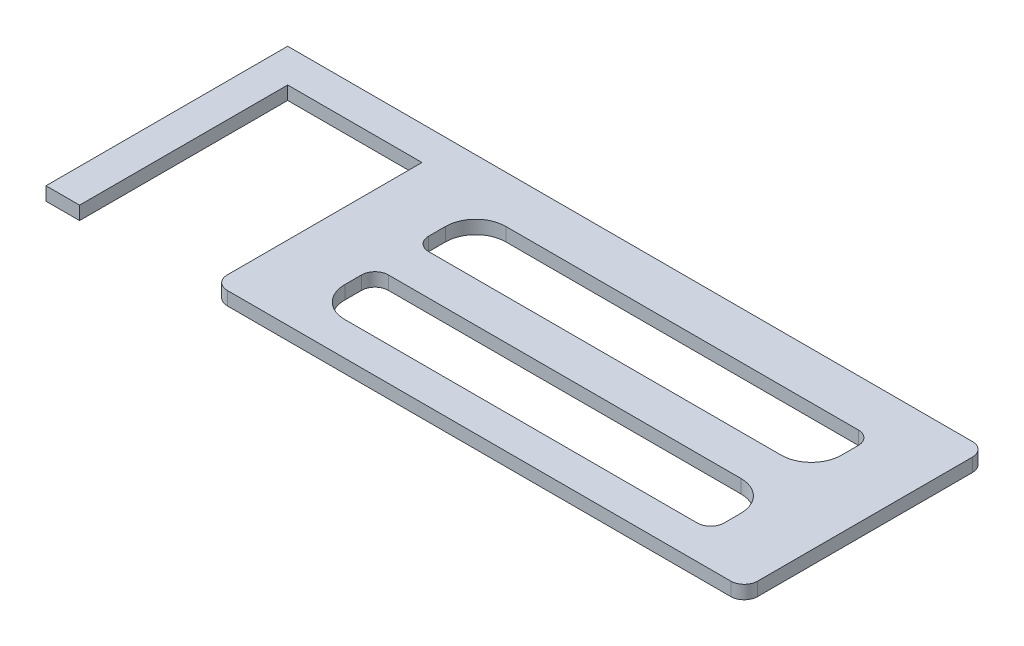
ISO-10303-21;
HEADER;
FILE_DESCRIPTION(('STEP AP214'),'2;1');
FILE_NAME('part.step','',(''),(''),'','','');
FILE_SCHEMA(('AUTOMOTIVE_DESIGN { 1 0 10303 214 1 1 1 1 }'));
ENDSEC;
DATA;
#1=APPLICATION_CONTEXT('core data for automotive mechanical design processes');
#2=APPLICATION_PROTOCOL_DEFINITION('international standard','automotive_design',2000,#1);
#3=PRODUCT_CONTEXT('',#1,'mechanical');
#4=PRODUCT('Part','Part','',(#3));
#5=PRODUCT_RELATED_PRODUCT_CATEGORY('part','',(#4));
#6=PRODUCT_DEFINITION_FORMATION('','',#4);
#7=PRODUCT_DEFINITION_CONTEXT('part definition',#1,'design');
#8=PRODUCT_DEFINITION('design','',#6,#7);
#9=PRODUCT_DEFINITION_SHAPE('','',#8);
#10=(LENGTH_UNIT() NAMED_UNIT(*) SI_UNIT(.MILLI.,.METRE.));
#11=(NAMED_UNIT(*) PLANE_ANGLE_UNIT() SI_UNIT($,.RADIAN.));
#12=(NAMED_UNIT(*) SI_UNIT($,.STERADIAN.) SOLID_ANGLE_UNIT());
#13=UNCERTAINTY_MEASURE_WITH_UNIT(LENGTH_MEASURE(1.E-05),#10,'distance_accuracy_value','');
#14=(GEOMETRIC_REPRESENTATION_CONTEXT(3) GLOBAL_UNCERTAINTY_ASSIGNED_CONTEXT((#13)) GLOBAL_UNIT_ASSIGNED_CONTEXT((#10,
#11,#12)) REPRESENTATION_CONTEXT('',''));
#15=CARTESIAN_POINT('',(0.,0.,0.));
#16=DIRECTION('',(0.,0.,1.));
#17=DIRECTION('',(1.,0.,0.));
#18=AXIS2_PLACEMENT_3D('',#15,#16,#17);
#19=CARTESIAN_POINT('',(-37.5,2.,16.));
#20=DIRECTION('',(0.,-1.,0.));
#21=DIRECTION('',(0.,0.,-1.));
#22=AXIS2_PLACEMENT_3D('',#19,#20,#21);
#23=PLANE('',#22);
#24=CARTESIAN_POINT('',(-25.,2.,8.5));
#25=DIRECTION('',(0.,1.,0.));
#26=DIRECTION('',(0.,0.,-1.));
#27=AXIS2_PLACEMENT_3D('',#24,#25,#26);
#28=CIRCLE('',#27,4.5);
#29=CARTESIAN_POINT('',(-29.5,2.,8.5));
#30=VERTEX_POINT('',#29);
#31=CARTESIAN_POINT('',(-25.,2.,13.));
#32=VERTEX_POINT('',#31);
#33=EDGE_CURVE('E277',#30,#32,#28,.T.);
#34=ORIENTED_EDGE('',*,*,#33,.F.);
#35=DIRECTION('',(0.,0.,1.));
#36=VECTOR('',#35,1.);
#37=CARTESIAN_POINT('',(-29.5,2.,6.00000000000002));
#38=LINE('',#37,#36);
#39=CARTESIAN_POINT('',(-29.5,2.,6.00000000000002));
#40=VERTEX_POINT('',#39);
#41=EDGE_CURVE('E293',#40,#30,#38,.T.);
#42=ORIENTED_EDGE('',*,*,#41,.F.);
#43=CARTESIAN_POINT('',(-27.5,2.,6.));
#44=DIRECTION('',(0.,1.,0.));
#45=DIRECTION('',(0.,0.,-1.));
#46=AXIS2_PLACEMENT_3D('',#43,#44,#45);
#47=CIRCLE('',#46,2.);
#48=CARTESIAN_POINT('',(-27.5,2.,4.));
#49=VERTEX_POINT('',#48);
#50=EDGE_CURVE('E290',#49,#40,#47,.T.);
#51=ORIENTED_EDGE('',*,*,#50,.F.);
#52=DIRECTION('',(-1.,0.,0.));
#53=VECTOR('',#52,1.);
#54=CARTESIAN_POINT('',(-27.5,2.,4.));
#55=LINE('',#54,#53);
#56=CARTESIAN_POINT('',(25.,2.,4.));
#57=VERTEX_POINT('',#56);
#58=EDGE_CURVE('E288',#57,#49,#55,.T.);
#59=ORIENTED_EDGE('',*,*,#58,.F.);
#60=CARTESIAN_POINT('',(25.,2.,8.5));
#61=DIRECTION('',(0.,1.,0.));
#62=DIRECTION('',(0.,0.,-1.));
#63=AXIS2_PLACEMENT_3D('',#60,#61,#62);
#64=CIRCLE('',#63,4.5);
#65=CARTESIAN_POINT('',(29.5,2.,8.5));
#66=VERTEX_POINT('',#65);
#67=EDGE_CURVE('E286',#66,#57,#64,.T.);
#68=ORIENTED_EDGE('',*,*,#67,.F.);
#69=DIRECTION('',(0.,0.,-1.));
#70=VECTOR('',#69,1.);
#71=CARTESIAN_POINT('',(29.5,2.,8.5));
#72=LINE('',#71,#70);
#73=CARTESIAN_POINT('',(29.5,2.,11.));
#74=VERTEX_POINT('',#73);
#75=EDGE_CURVE('E284',#74,#66,#72,.T.);
#76=ORIENTED_EDGE('',*,*,#75,.F.);
#77=CARTESIAN_POINT('',(27.5,2.,11.));
#78=DIRECTION('',(0.,1.,0.));
#79=DIRECTION('',(0.,0.,1.));
#80=AXIS2_PLACEMENT_3D('',#77,#78,#79);
#81=CIRCLE('',#80,2.);
#82=CARTESIAN_POINT('',(27.5,2.,13.));
#83=VERTEX_POINT('',#82);
#84=EDGE_CURVE('E282',#83,#74,#81,.T.);
#85=ORIENTED_EDGE('',*,*,#84,.F.);
#86=DIRECTION('',(1.,0.,0.));
#87=VECTOR('',#86,1.);
#88=CARTESIAN_POINT('',(-25.,2.,13.));
#89=LINE('',#88,#87);
#90=EDGE_CURVE('E279',#32,#83,#89,.T.);
#91=ORIENTED_EDGE('',*,*,#90,.F.);
#92=EDGE_LOOP('',(#34,#42,#51,#59,#68,#76,#85,#91));
#93=FACE_BOUND('',#92,.T.);
#94=DIRECTION('',(-1.,0.,0.));
#95=VECTOR('',#94,1.);
#96=CARTESIAN_POINT('',(-39.5,2.,-18.));
#97=LINE('',#96,#95);
#98=CARTESIAN_POINT('',(37.5,2.,-18.));
#99=VERTEX_POINT('',#98);
#100=CARTESIAN_POINT('',(-64.5,2.,-18.));
#101=VERTEX_POINT('',#100);
#102=EDGE_CURVE('E336',#99,#101,#97,.T.);
#103=ORIENTED_EDGE('',*,*,#102,.T.);
#104=DIRECTION('',(0.,0.,1.));
#105=VECTOR('',#104,1.);
#106=CARTESIAN_POINT('',(-64.5,2.,-18.));
#107=LINE('',#106,#105);
#108=CARTESIAN_POINT('',(-64.5,2.,18.));
#109=VERTEX_POINT('',#108);
#110=EDGE_CURVE('E339',#101,#109,#107,.T.);
#111=ORIENTED_EDGE('',*,*,#110,.T.);
#112=DIRECTION('',(1.,0.,0.));
#113=VECTOR('',#112,1.);
#114=CARTESIAN_POINT('',(-64.5,2.,18.));
#115=LINE('',#114,#113);
#116=CARTESIAN_POINT('',(-59.5,2.,18.));
#117=VERTEX_POINT('',#116);
#118=EDGE_CURVE('E342',#109,#117,#115,.T.);
#119=ORIENTED_EDGE('',*,*,#118,.T.);
#120=DIRECTION('',(0.,0.,-1.));
#121=VECTOR('',#120,1.);
#122=CARTESIAN_POINT('',(-59.5,2.,18.));
#123=LINE('',#122,#121);
#124=CARTESIAN_POINT('',(-59.5,2.,-13.));
#125=VERTEX_POINT('',#124);
#126=EDGE_CURVE('E344',#117,#125,#123,.T.);
#127=ORIENTED_EDGE('',*,*,#126,.T.);
#128=DIRECTION('',(1.,0.,0.));
#129=VECTOR('',#128,1.);
#130=CARTESIAN_POINT('',(-39.5,2.,-13.));
#131=LINE('',#130,#129);
#132=CARTESIAN_POINT('',(-39.5,2.,-13.));
#133=VERTEX_POINT('',#132);
#134=EDGE_CURVE('E346',#125,#133,#131,.T.);
#135=ORIENTED_EDGE('',*,*,#134,.T.);
#136=DIRECTION('',(0.,0.,1.));
#137=VECTOR('',#136,1.);
#138=CARTESIAN_POINT('',(-39.5,2.,16.));
#139=LINE('',#138,#137);
#140=CARTESIAN_POINT('',(-39.5,2.,16.));
#141=VERTEX_POINT('',#140);
#142=EDGE_CURVE('E348',#133,#141,#139,.T.);
#143=ORIENTED_EDGE('',*,*,#142,.T.);
#144=CARTESIAN_POINT('',(-37.5,2.,16.));
#145=DIRECTION('',(0.,1.,0.));
#146=DIRECTION('',(0.,0.,-1.));
#147=AXIS2_PLACEMENT_3D('',#144,#145,#146);
#148=CIRCLE('',#147,2.);
#149=CARTESIAN_POINT('',(-37.5,2.,18.));
#150=VERTEX_POINT('',#149);
#151=EDGE_CURVE('E350',#141,#150,#148,.T.);
#152=ORIENTED_EDGE('',*,*,#151,.T.);
#153=DIRECTION('',(1.,0.,0.));
#154=VECTOR('',#153,1.);
#155=CARTESIAN_POINT('',(-37.5,2.,18.));
#156=LINE('',#155,#154);
#157=CARTESIAN_POINT('',(37.5,2.,18.));
#158=VERTEX_POINT('',#157);
#159=EDGE_CURVE('E352',#150,#158,#156,.T.);
#160=ORIENTED_EDGE('',*,*,#159,.T.);
#161=CARTESIAN_POINT('',(37.5,2.,16.));
#162=DIRECTION('',(0.,1.,0.));
#163=DIRECTION('',(0.,0.,1.));
#164=AXIS2_PLACEMENT_3D('',#161,#162,#163);
#165=CIRCLE('',#164,2.);
#166=CARTESIAN_POINT('',(39.5,2.,16.));
#167=VERTEX_POINT('',#166);
#168=EDGE_CURVE('E354',#158,#167,#165,.T.);
#169=ORIENTED_EDGE('',*,*,#168,.T.);
#170=DIRECTION('',(0.,0.,-1.));
#171=VECTOR('',#170,1.);
#172=CARTESIAN_POINT('',(39.5,2.,16.));
#173=LINE('',#172,#171);
#174=CARTESIAN_POINT('',(39.5,2.,-16.));
#175=VERTEX_POINT('',#174);
#176=EDGE_CURVE('E356',#167,#175,#173,.T.);
#177=ORIENTED_EDGE('',*,*,#176,.T.);
#178=CARTESIAN_POINT('',(37.5,2.,-16.));
#179=DIRECTION('',(0.,1.,0.));
#180=DIRECTION('',(0.,0.,-1.));
#181=AXIS2_PLACEMENT_3D('',#178,#179,#180);
#182=CIRCLE('',#181,2.);
#183=EDGE_CURVE('E358',#175,#99,#182,.T.);
#184=ORIENTED_EDGE('',*,*,#183,.T.);
#185=EDGE_LOOP('',(#103,#111,#119,#127,#135,#143,#152,#160,#169,#177,#184));
#186=FACE_BOUND('',#185,.T.);
#187=CARTESIAN_POINT('',(25.,2.,-6.5));
#188=DIRECTION('',(0.,1.,0.));
#189=DIRECTION('',(0.,0.,-1.));
#190=AXIS2_PLACEMENT_3D('',#187,#188,#189);
#191=CIRCLE('',#190,4.5);
#192=CARTESIAN_POINT('',(25.,2.,-2.));
#193=VERTEX_POINT('',#192);
#194=CARTESIAN_POINT('',(29.5,2.,-6.50000000000003));
#195=VERTEX_POINT('',#194);
#196=EDGE_CURVE('E212',#193,#195,#191,.T.);
#197=ORIENTED_EDGE('',*,*,#196,.F.);
#198=DIRECTION('',(1.,0.,0.));
#199=VECTOR('',#198,1.);
#200=CARTESIAN_POINT('',(-27.5,2.,-2.));
#201=LINE('',#200,#199);
#202=CARTESIAN_POINT('',(-27.5,2.,-2.));
#203=VERTEX_POINT('',#202);
#204=EDGE_CURVE('E245',#203,#193,#201,.T.);
#205=ORIENTED_EDGE('',*,*,#204,.F.);
#206=CARTESIAN_POINT('',(-27.5,2.,-4.));
#207=DIRECTION('',(0.,1.,0.));
#208=DIRECTION('',(0.,0.,-1.));
#209=AXIS2_PLACEMENT_3D('',#206,#207,#208);
#210=CIRCLE('',#209,2.);
#211=CARTESIAN_POINT('',(-29.5,2.,-4.00000000000002));
#212=VERTEX_POINT('',#211);
#213=EDGE_CURVE('E243',#212,#203,#210,.T.);
#214=ORIENTED_EDGE('',*,*,#213,.F.);
#215=DIRECTION('',(0.,0.,1.));
#216=VECTOR('',#215,1.);
#217=CARTESIAN_POINT('',(-29.5,2.,-6.49999999999997));
#218=LINE('',#217,#216);
#219=CARTESIAN_POINT('',(-29.5,2.,-6.49999999999997));
#220=VERTEX_POINT('',#219);
#221=EDGE_CURVE('E241',#220,#212,#218,.T.);
#222=ORIENTED_EDGE('',*,*,#221,.F.);
#223=CARTESIAN_POINT('',(-25.,2.,-6.5));
#224=DIRECTION('',(0.,1.,0.));
#225=DIRECTION('',(0.,0.,-1.));
#226=AXIS2_PLACEMENT_3D('',#223,#224,#225);
#227=CIRCLE('',#226,4.5);
#228=CARTESIAN_POINT('',(-25.,2.,-11.));
#229=VERTEX_POINT('',#228);
#230=EDGE_CURVE('E239',#229,#220,#227,.T.);
#231=ORIENTED_EDGE('',*,*,#230,.F.);
#232=DIRECTION('',(-1.,0.,0.));
#233=VECTOR('',#232,1.);
#234=CARTESIAN_POINT('',(-25.,2.,-11.));
#235=LINE('',#234,#233);
#236=CARTESIAN_POINT('',(27.5,2.,-11.));
#237=VERTEX_POINT('',#236);
#238=EDGE_CURVE('E235',#237,#229,#235,.T.);
#239=ORIENTED_EDGE('',*,*,#238,.F.);
#240=CARTESIAN_POINT('',(27.5,2.,-9.));
#241=DIRECTION('',(0.,1.,0.));
#242=DIRECTION('',(0.,0.,-1.));
#243=AXIS2_PLACEMENT_3D('',#240,#241,#242);
#244=CIRCLE('',#243,2.);
#245=CARTESIAN_POINT('',(29.5,2.,-8.99999999999999));
#246=VERTEX_POINT('',#245);
#247=EDGE_CURVE('E233',#246,#237,#244,.T.);
#248=ORIENTED_EDGE('',*,*,#247,.F.);
#249=DIRECTION('',(0.,0.,-1.));
#250=VECTOR('',#249,1.);
#251=CARTESIAN_POINT('',(29.5,2.,-8.99999999999999));
#252=LINE('',#251,#250);
#253=EDGE_CURVE('E220',#195,#246,#252,.T.);
#254=ORIENTED_EDGE('',*,*,#253,.F.);
#255=EDGE_LOOP('',(#197,#205,#214,#222,#231,#239,#248,#254));
#256=FACE_BOUND('',#255,.T.);
#257=ADVANCED_FACE('F33',(#93,#186,#256),#23,.F.);
#258=CARTESIAN_POINT('',(-37.5,0.,16.));
#259=DIRECTION('',(0.,-1.,0.));
#260=DIRECTION('',(0.,0.,-1.));
#261=AXIS2_PLACEMENT_3D('',#258,#259,#260);
#262=PLANE('',#261);
#263=DIRECTION('',(0.,0.,1.));
#264=VECTOR('',#263,1.);
#265=CARTESIAN_POINT('',(-64.5,0.,-18.));
#266=LINE('',#265,#264);
#267=CARTESIAN_POINT('',(-64.5,0.,-18.));
#268=VERTEX_POINT('',#267);
#269=CARTESIAN_POINT('',(-64.5,0.,18.));
#270=VERTEX_POINT('',#269);
#271=EDGE_CURVE('E335',#268,#270,#266,.T.);
#272=ORIENTED_EDGE('',*,*,#271,.F.);
#273=DIRECTION('',(-1.,0.,0.));
#274=VECTOR('',#273,1.);
#275=CARTESIAN_POINT('',(-39.5,0.,-18.));
#276=LINE('',#275,#274);
#277=CARTESIAN_POINT('',(37.5,0.,-18.));
#278=VERTEX_POINT('',#277);
#279=EDGE_CURVE('E340',#278,#268,#276,.T.);
#280=ORIENTED_EDGE('',*,*,#279,.F.);
#281=CARTESIAN_POINT('',(37.5,0.,-16.));
#282=DIRECTION('',(0.,1.,0.));
#283=DIRECTION('',(0.,0.,-1.));
#284=AXIS2_PLACEMENT_3D('',#281,#282,#283);
#285=CIRCLE('',#284,2.);
#286=CARTESIAN_POINT('',(39.5,0.,-16.));
#287=VERTEX_POINT('',#286);
#288=EDGE_CURVE('E379',#287,#278,#285,.T.);
#289=ORIENTED_EDGE('',*,*,#288,.F.);
#290=DIRECTION('',(0.,0.,-1.));
#291=VECTOR('',#290,1.);
#292=CARTESIAN_POINT('',(39.5,0.,16.));
#293=LINE('',#292,#291);
#294=CARTESIAN_POINT('',(39.5,0.,16.));
#295=VERTEX_POINT('',#294);
#296=EDGE_CURVE('E377',#295,#287,#293,.T.);
#297=ORIENTED_EDGE('',*,*,#296,.F.);
#298=CARTESIAN_POINT('',(37.5,0.,16.));
#299=DIRECTION('',(0.,1.,0.));
#300=DIRECTION('',(0.,0.,1.));
#301=AXIS2_PLACEMENT_3D('',#298,#299,#300);
#302=CIRCLE('',#301,2.);
#303=CARTESIAN_POINT('',(37.5,0.,18.));
#304=VERTEX_POINT('',#303);
#305=EDGE_CURVE('E375',#304,#295,#302,.T.);
#306=ORIENTED_EDGE('',*,*,#305,.F.);
#307=DIRECTION('',(1.,0.,0.));
#308=VECTOR('',#307,1.);
#309=CARTESIAN_POINT('',(-37.5,0.,18.));
#310=LINE('',#309,#308);
#311=CARTESIAN_POINT('',(-37.5,0.,18.));
#312=VERTEX_POINT('',#311);
#313=EDGE_CURVE('E373',#312,#304,#310,.T.);
#314=ORIENTED_EDGE('',*,*,#313,.F.);
#315=CARTESIAN_POINT('',(-37.5,0.,16.));
#316=DIRECTION('',(0.,1.,0.));
#317=DIRECTION('',(0.,0.,-1.));
#318=AXIS2_PLACEMENT_3D('',#315,#316,#317);
#319=CIRCLE('',#318,2.);
#320=CARTESIAN_POINT('',(-39.5,0.,16.));
#321=VERTEX_POINT('',#320);
#322=EDGE_CURVE('E371',#321,#312,#319,.T.);
#323=ORIENTED_EDGE('',*,*,#322,.F.);
#324=DIRECTION('',(0.,0.,1.));
#325=VECTOR('',#324,1.);
#326=CARTESIAN_POINT('',(-39.5,0.,16.));
#327=LINE('',#326,#325);
#328=CARTESIAN_POINT('',(-39.5,0.,-13.));
#329=VERTEX_POINT('',#328);
#330=EDGE_CURVE('E369',#329,#321,#327,.T.);
#331=ORIENTED_EDGE('',*,*,#330,.F.);
#332=DIRECTION('',(1.,0.,0.));
#333=VECTOR('',#332,1.);
#334=CARTESIAN_POINT('',(-39.5,0.,-13.));
#335=LINE('',#334,#333);
#336=CARTESIAN_POINT('',(-59.5,0.,-13.));
#337=VERTEX_POINT('',#336);
#338=EDGE_CURVE('E367',#337,#329,#335,.T.);
#339=ORIENTED_EDGE('',*,*,#338,.F.);
#340=DIRECTION('',(0.,0.,-1.));
#341=VECTOR('',#340,1.);
#342=CARTESIAN_POINT('',(-59.5,0.,18.));
#343=LINE('',#342,#341);
#344=CARTESIAN_POINT('',(-59.5,0.,18.));
#345=VERTEX_POINT('',#344);
#346=EDGE_CURVE('E365',#345,#337,#343,.T.);
#347=ORIENTED_EDGE('',*,*,#346,.F.);
#348=DIRECTION('',(1.,0.,0.));
#349=VECTOR('',#348,1.);
#350=CARTESIAN_POINT('',(-64.5,0.,18.));
#351=LINE('',#350,#349);
#352=EDGE_CURVE('E363',#270,#345,#351,.T.);
#353=ORIENTED_EDGE('',*,*,#352,.F.);
#354=EDGE_LOOP('',(#272,#280,#289,#297,#306,#314,#323,#331,#339,#347,#353));
#355=FACE_BOUND('',#354,.T.);
#356=DIRECTION('',(0.,0.,1.));
#357=VECTOR('',#356,1.);
#358=CARTESIAN_POINT('',(-29.5,0.,6.00000000000002));
#359=LINE('',#358,#357);
#360=CARTESIAN_POINT('',(-29.5,0.,6.00000000000002));
#361=VERTEX_POINT('',#360);
#362=CARTESIAN_POINT('',(-29.5,0.,8.5));
#363=VERTEX_POINT('',#362);
#364=EDGE_CURVE('E280',#361,#363,#359,.T.);
#365=ORIENTED_EDGE('',*,*,#364,.T.);
#366=CARTESIAN_POINT('',(-25.,0.,8.5));
#367=DIRECTION('',(0.,1.,0.));
#368=DIRECTION('',(0.,0.,-1.));
#369=AXIS2_PLACEMENT_3D('',#366,#367,#368);
#370=CIRCLE('',#369,4.5);
#371=CARTESIAN_POINT('',(-25.,0.,13.));
#372=VERTEX_POINT('',#371);
#373=EDGE_CURVE('E228',#363,#372,#370,.T.);
#374=ORIENTED_EDGE('',*,*,#373,.T.);
#375=DIRECTION('',(1.,0.,0.));
#376=VECTOR('',#375,1.);
#377=CARTESIAN_POINT('',(-25.,0.,13.));
#378=LINE('',#377,#376);
#379=CARTESIAN_POINT('',(27.5,0.,13.));
#380=VERTEX_POINT('',#379);
#381=EDGE_CURVE('E298',#372,#380,#378,.T.);
#382=ORIENTED_EDGE('',*,*,#381,.T.);
#383=CARTESIAN_POINT('',(27.5,0.,11.));
#384=DIRECTION('',(0.,1.,0.));
#385=DIRECTION('',(0.,0.,1.));
#386=AXIS2_PLACEMENT_3D('',#383,#384,#385);
#387=CIRCLE('',#386,2.);
#388=CARTESIAN_POINT('',(29.5,0.,11.));
#389=VERTEX_POINT('',#388);
#390=EDGE_CURVE('E301',#380,#389,#387,.T.);
#391=ORIENTED_EDGE('',*,*,#390,.T.);
#392=DIRECTION('',(0.,0.,-1.));
#393=VECTOR('',#392,1.);
#394=CARTESIAN_POINT('',(29.5,0.,8.5));
#395=LINE('',#394,#393);
#396=CARTESIAN_POINT('',(29.5,0.,8.5));
#397=VERTEX_POINT('',#396);
#398=EDGE_CURVE('E304',#389,#397,#395,.T.);
#399=ORIENTED_EDGE('',*,*,#398,.T.);
#400=CARTESIAN_POINT('',(25.,0.,8.5));
#401=DIRECTION('',(0.,1.,0.));
#402=DIRECTION('',(0.,0.,-1.));
#403=AXIS2_PLACEMENT_3D('',#400,#401,#402);
#404=CIRCLE('',#403,4.5);
#405=CARTESIAN_POINT('',(25.,0.,4.));
#406=VERTEX_POINT('',#405);
#407=EDGE_CURVE('E307',#397,#406,#404,.T.);
#408=ORIENTED_EDGE('',*,*,#407,.T.);
#409=DIRECTION('',(-1.,0.,0.));
#410=VECTOR('',#409,1.);
#411=CARTESIAN_POINT('',(-27.5,0.,4.));
#412=LINE('',#411,#410);
#413=CARTESIAN_POINT('',(-27.5,0.,4.));
#414=VERTEX_POINT('',#413);
#415=EDGE_CURVE('E310',#406,#414,#412,.T.);
#416=ORIENTED_EDGE('',*,*,#415,.T.);
#417=CARTESIAN_POINT('',(-27.5,0.,6.));
#418=DIRECTION('',(0.,1.,0.));
#419=DIRECTION('',(0.,0.,-1.));
#420=AXIS2_PLACEMENT_3D('',#417,#418,#419);
#421=CIRCLE('',#420,2.);
#422=EDGE_CURVE('E313',#414,#361,#421,.T.);
#423=ORIENTED_EDGE('',*,*,#422,.T.);
#424=EDGE_LOOP('',(#365,#374,#382,#391,#399,#408,#416,#423));
#425=FACE_BOUND('',#424,.T.);
#426=DIRECTION('',(1.,0.,0.));
#427=VECTOR('',#426,1.);
#428=CARTESIAN_POINT('',(-27.5,0.,-2.));
#429=LINE('',#428,#427);
#430=CARTESIAN_POINT('',(-27.5,0.,-2.));
#431=VERTEX_POINT('',#430);
#432=CARTESIAN_POINT('',(25.,0.,-2.));
#433=VERTEX_POINT('',#432);
#434=EDGE_CURVE('E221',#431,#433,#429,.T.);
#435=ORIENTED_EDGE('',*,*,#434,.T.);
#436=CARTESIAN_POINT('',(25.,0.,-6.5));
#437=DIRECTION('',(0.,1.,0.));
#438=DIRECTION('',(0.,0.,-1.));
#439=AXIS2_PLACEMENT_3D('',#436,#437,#438);
#440=CIRCLE('',#439,4.5);
#441=CARTESIAN_POINT('',(29.5,0.,-6.50000000000003));
#442=VERTEX_POINT('',#441);
#443=EDGE_CURVE('E56',#433,#442,#440,.T.);
#444=ORIENTED_EDGE('',*,*,#443,.T.);
#445=DIRECTION('',(0.,0.,-1.));
#446=VECTOR('',#445,1.);
#447=CARTESIAN_POINT('',(29.5,0.,-8.99999999999999));
#448=LINE('',#447,#446);
#449=CARTESIAN_POINT('',(29.5,0.,-8.99999999999999));
#450=VERTEX_POINT('',#449);
#451=EDGE_CURVE('E227',#442,#450,#448,.T.);
#452=ORIENTED_EDGE('',*,*,#451,.T.);
#453=CARTESIAN_POINT('',(27.5,0.,-9.));
#454=DIRECTION('',(0.,1.,0.));
#455=DIRECTION('',(0.,0.,-1.));
#456=AXIS2_PLACEMENT_3D('',#453,#454,#455);
#457=CIRCLE('',#456,2.);
#458=CARTESIAN_POINT('',(27.5,0.,-11.));
#459=VERTEX_POINT('',#458);
#460=EDGE_CURVE('E249',#450,#459,#457,.T.);
#461=ORIENTED_EDGE('',*,*,#460,.T.);
#462=DIRECTION('',(-1.,0.,0.));
#463=VECTOR('',#462,1.);
#464=CARTESIAN_POINT('',(-25.,0.,-11.));
#465=LINE('',#464,#463);
#466=CARTESIAN_POINT('',(-25.,0.,-11.));
#467=VERTEX_POINT('',#466);
#468=EDGE_CURVE('E252',#459,#467,#465,.T.);
#469=ORIENTED_EDGE('',*,*,#468,.T.);
#470=CARTESIAN_POINT('',(-25.,0.,-6.5));
#471=DIRECTION('',(0.,1.,0.));
#472=DIRECTION('',(0.,0.,-1.));
#473=AXIS2_PLACEMENT_3D('',#470,#471,#472);
#474=CIRCLE('',#473,4.5);
#475=CARTESIAN_POINT('',(-29.5,0.,-6.49999999999997));
#476=VERTEX_POINT('',#475);
#477=EDGE_CURVE('E255',#467,#476,#474,.T.);
#478=ORIENTED_EDGE('',*,*,#477,.T.);
#479=DIRECTION('',(0.,0.,1.));
#480=VECTOR('',#479,1.);
#481=CARTESIAN_POINT('',(-29.5,0.,-6.49999999999997));
#482=LINE('',#481,#480);
#483=CARTESIAN_POINT('',(-29.5,0.,-4.00000000000002));
#484=VERTEX_POINT('',#483);
#485=EDGE_CURVE('E258',#476,#484,#482,.T.);
#486=ORIENTED_EDGE('',*,*,#485,.T.);
#487=CARTESIAN_POINT('',(-27.5,0.,-4.));
#488=DIRECTION('',(0.,1.,0.));
#489=DIRECTION('',(0.,0.,-1.));
#490=AXIS2_PLACEMENT_3D('',#487,#488,#489);
#491=CIRCLE('',#490,2.);
#492=EDGE_CURVE('E261',#484,#431,#491,.T.);
#493=ORIENTED_EDGE('',*,*,#492,.T.);
#494=EDGE_LOOP('',(#435,#444,#452,#461,#469,#478,#486,#493));
#495=FACE_BOUND('',#494,.T.);
#496=ADVANCED_FACE('F418',(#355,#425,#495),#262,.T.);
#497=CARTESIAN_POINT('',(-64.5,2.,-18.));
#498=DIRECTION('',(1.,0.,0.));
#499=DIRECTION('',(0.,0.,-1.));
#500=AXIS2_PLACEMENT_3D('',#497,#498,#499);
#501=PLANE('',#500);
#502=ORIENTED_EDGE('',*,*,#271,.T.);
#503=DIRECTION('',(0.,-1.,0.));
#504=VECTOR('',#503,1.);
#505=CARTESIAN_POINT('',(-64.5,2.,18.));
#506=LINE('',#505,#504);
#507=EDGE_CURVE('E41',#109,#270,#506,.T.);
#508=ORIENTED_EDGE('',*,*,#507,.F.);
#509=ORIENTED_EDGE('',*,*,#110,.F.);
#510=DIRECTION('',(0.,-1.,0.));
#511=VECTOR('',#510,1.);
#512=CARTESIAN_POINT('',(-64.5,2.,-18.));
#513=LINE('',#512,#511);
#514=EDGE_CURVE('E11',#101,#268,#513,.T.);
#515=ORIENTED_EDGE('',*,*,#514,.T.);
#516=EDGE_LOOP('',(#502,#508,#509,#515));
#517=FACE_BOUND('',#516,.T.);
#518=ADVANCED_FACE('F35',(#517),#501,.F.);
#519=CARTESIAN_POINT('',(-64.5,2.,18.));
#520=DIRECTION('',(0.,0.,-1.));
#521=DIRECTION('',(-1.,0.,0.));
#522=AXIS2_PLACEMENT_3D('',#519,#520,#521);
#523=PLANE('',#522);
#524=ORIENTED_EDGE('',*,*,#352,.T.);
#525=DIRECTION('',(0.,-1.,0.));
#526=VECTOR('',#525,1.);
#527=CARTESIAN_POINT('',(-59.5,2.,18.));
#528=LINE('',#527,#526);
#529=EDGE_CURVE('E405',#117,#345,#528,.T.);
#530=ORIENTED_EDGE('',*,*,#529,.F.);
#531=ORIENTED_EDGE('',*,*,#118,.F.);
#532=ORIENTED_EDGE('',*,*,#507,.T.);
#533=EDGE_LOOP('',(#524,#530,#531,#532));
#534=FACE_BOUND('',#533,.T.);
#535=ADVANCED_FACE('F412',(#534),#523,.F.);
#536=CARTESIAN_POINT('',(-59.5,2.,18.));
#537=DIRECTION('',(-1.,0.,0.));
#538=DIRECTION('',(0.,0.,1.));
#539=AXIS2_PLACEMENT_3D('',#536,#537,#538);
#540=PLANE('',#539);
#541=ORIENTED_EDGE('',*,*,#346,.T.);
#542=DIRECTION('',(0.,-1.,0.));
#543=VECTOR('',#542,1.);
#544=CARTESIAN_POINT('',(-59.5,2.,-13.));
#545=LINE('',#544,#543);
#546=EDGE_CURVE('E402',#125,#337,#545,.T.);
#547=ORIENTED_EDGE('',*,*,#546,.F.);
#548=ORIENTED_EDGE('',*,*,#126,.F.);
#549=ORIENTED_EDGE('',*,*,#529,.T.);
#550=EDGE_LOOP('',(#541,#547,#548,#549));
#551=FACE_BOUND('',#550,.T.);
#552=ADVANCED_FACE('F425',(#551),#540,.F.);
#553=CARTESIAN_POINT('',(-39.5,2.,-13.));
#554=DIRECTION('',(0.,0.,-1.));
#555=DIRECTION('',(-1.,0.,0.));
#556=AXIS2_PLACEMENT_3D('',#553,#554,#555);
#557=PLANE('',#556);
#558=ORIENTED_EDGE('',*,*,#338,.T.);
#559=DIRECTION('',(0.,-1.,0.));
#560=VECTOR('',#559,1.);
#561=CARTESIAN_POINT('',(-39.5,2.,-13.));
#562=LINE('',#561,#560);
#563=EDGE_CURVE('E399',#133,#329,#562,.T.);
#564=ORIENTED_EDGE('',*,*,#563,.F.);
#565=ORIENTED_EDGE('',*,*,#134,.F.);
#566=ORIENTED_EDGE('',*,*,#546,.T.);
#567=EDGE_LOOP('',(#558,#564,#565,#566));
#568=FACE_BOUND('',#567,.T.);
#569=ADVANCED_FACE('F429',(#568),#557,.F.);
#570=CARTESIAN_POINT('',(-39.5,2.,16.));
#571=DIRECTION('',(1.,0.,0.));
#572=DIRECTION('',(0.,0.,-1.));
#573=AXIS2_PLACEMENT_3D('',#570,#571,#572);
#574=PLANE('',#573);
#575=ORIENTED_EDGE('',*,*,#330,.T.);
#576=DIRECTION('',(0.,-1.,0.));
#577=VECTOR('',#576,1.);
#578=CARTESIAN_POINT('',(-39.5,2.,16.));
#579=LINE('',#578,#577);
#580=EDGE_CURVE('E396',#141,#321,#579,.T.);
#581=ORIENTED_EDGE('',*,*,#580,.F.);
#582=ORIENTED_EDGE('',*,*,#142,.F.);
#583=ORIENTED_EDGE('',*,*,#563,.T.);
#584=EDGE_LOOP('',(#575,#581,#582,#583));
#585=FACE_BOUND('',#584,.T.);
#586=ADVANCED_FACE('F463',(#585),#574,.F.);
#587=CARTESIAN_POINT('',(-37.5,2.,16.));
#588=DIRECTION('',(0.,-1.,0.));
#589=DIRECTION('',(0.,0.,-1.));
#590=AXIS2_PLACEMENT_3D('',#587,#588,#589);
#591=CYLINDRICAL_SURFACE('',#590,2.);
#592=ORIENTED_EDGE('',*,*,#322,.T.);
#593=DIRECTION('',(0.,-1.,0.));
#594=VECTOR('',#593,1.);
#595=CARTESIAN_POINT('',(-37.5,2.,18.));
#596=LINE('',#595,#594);
#597=EDGE_CURVE('E393',#150,#312,#596,.T.);
#598=ORIENTED_EDGE('',*,*,#597,.F.);
#599=ORIENTED_EDGE('',*,*,#151,.F.);
#600=ORIENTED_EDGE('',*,*,#580,.T.);
#601=EDGE_LOOP('',(#592,#598,#599,#600));
#602=FACE_BOUND('',#601,.T.);
#603=ADVANCED_FACE('F461',(#602),#591,.T.);
#604=CARTESIAN_POINT('',(-37.5,2.,18.));
#605=DIRECTION('',(0.,0.,-1.));
#606=DIRECTION('',(-1.,0.,0.));
#607=AXIS2_PLACEMENT_3D('',#604,#605,#606);
#608=PLANE('',#607);
#609=ORIENTED_EDGE('',*,*,#313,.T.);
#610=DIRECTION('',(0.,-1.,0.));
#611=VECTOR('',#610,1.);
#612=CARTESIAN_POINT('',(37.5,2.,18.));
#613=LINE('',#612,#611);
#614=EDGE_CURVE('E390',#158,#304,#613,.T.);
#615=ORIENTED_EDGE('',*,*,#614,.F.);
#616=ORIENTED_EDGE('',*,*,#159,.F.);
#617=ORIENTED_EDGE('',*,*,#597,.T.);
#618=EDGE_LOOP('',(#609,#615,#616,#617));
#619=FACE_BOUND('',#618,.T.);
#620=ADVANCED_FACE('F456',(#619),#608,.F.);
#621=CARTESIAN_POINT('',(37.5,2.,16.));
#622=DIRECTION('',(0.,-1.,0.));
#623=DIRECTION('',(0.,0.,-1.));
#624=AXIS2_PLACEMENT_3D('',#621,#622,#623);
#625=CYLINDRICAL_SURFACE('',#624,2.);
#626=ORIENTED_EDGE('',*,*,#305,.T.);
#627=DIRECTION('',(0.,-1.,0.));
#628=VECTOR('',#627,1.);
#629=CARTESIAN_POINT('',(39.5,2.,16.));
#630=LINE('',#629,#628);
#631=EDGE_CURVE('E387',#167,#295,#630,.T.);
#632=ORIENTED_EDGE('',*,*,#631,.F.);
#633=ORIENTED_EDGE('',*,*,#168,.F.);
#634=ORIENTED_EDGE('',*,*,#614,.T.);
#635=EDGE_LOOP('',(#626,#632,#633,#634));
#636=FACE_BOUND('',#635,.T.);
#637=ADVANCED_FACE('F451',(#636),#625,.T.);
#638=CARTESIAN_POINT('',(39.5,2.,16.));
#639=DIRECTION('',(-1.,0.,0.));
#640=DIRECTION('',(0.,0.,1.));
#641=AXIS2_PLACEMENT_3D('',#638,#639,#640);
#642=PLANE('',#641);
#643=ORIENTED_EDGE('',*,*,#296,.T.);
#644=DIRECTION('',(0.,-1.,0.));
#645=VECTOR('',#644,1.);
#646=CARTESIAN_POINT('',(39.5,2.,-16.));
#647=LINE('',#646,#645);
#648=EDGE_CURVE('E384',#175,#287,#647,.T.);
#649=ORIENTED_EDGE('',*,*,#648,.F.);
#650=ORIENTED_EDGE('',*,*,#176,.F.);
#651=ORIENTED_EDGE('',*,*,#631,.T.);
#652=EDGE_LOOP('',(#643,#649,#650,#651));
#653=FACE_BOUND('',#652,.T.);
#654=ADVANCED_FACE('F447',(#653),#642,.F.);
#655=CARTESIAN_POINT('',(37.5,2.,-16.));
#656=DIRECTION('',(0.,-1.,0.));
#657=DIRECTION('',(0.,0.,-1.));
#658=AXIS2_PLACEMENT_3D('',#655,#656,#657);
#659=CYLINDRICAL_SURFACE('',#658,2.);
#660=ORIENTED_EDGE('',*,*,#288,.T.);
#661=DIRECTION('',(0.,-1.,0.));
#662=VECTOR('',#661,1.);
#663=CARTESIAN_POINT('',(37.5,2.,-18.));
#664=LINE('',#663,#662);
#665=EDGE_CURVE('E361',#99,#278,#664,.T.);
#666=ORIENTED_EDGE('',*,*,#665,.F.);
#667=ORIENTED_EDGE('',*,*,#183,.F.);
#668=ORIENTED_EDGE('',*,*,#648,.T.);
#669=EDGE_LOOP('',(#660,#666,#667,#668));
#670=FACE_BOUND('',#669,.T.);
#671=ADVANCED_FACE('F442',(#670),#659,.T.);
#672=CARTESIAN_POINT('',(-39.5,2.,-18.));
#673=DIRECTION('',(0.,0.,1.));
#674=DIRECTION('',(1.,0.,0.));
#675=AXIS2_PLACEMENT_3D('',#672,#673,#674);
#676=PLANE('',#675);
#677=ORIENTED_EDGE('',*,*,#279,.T.);
#678=ORIENTED_EDGE('',*,*,#514,.F.);
#679=ORIENTED_EDGE('',*,*,#102,.F.);
#680=ORIENTED_EDGE('',*,*,#665,.T.);
#681=EDGE_LOOP('',(#677,#678,#679,#680));
#682=FACE_BOUND('',#681,.T.);
#683=ADVANCED_FACE('F436',(#682),#676,.F.);
#684=CARTESIAN_POINT('',(-25.,2.,8.5));
#685=DIRECTION('',(0.,-1.,0.));
#686=DIRECTION('',(0.,0.,-1.));
#687=AXIS2_PLACEMENT_3D('',#684,#685,#686);
#688=CYLINDRICAL_SURFACE('',#687,4.5);
#689=ORIENTED_EDGE('',*,*,#373,.F.);
#690=DIRECTION('',(0.,-1.,0.));
#691=VECTOR('',#690,1.);
#692=CARTESIAN_POINT('',(-29.5,2.,8.5));
#693=LINE('',#692,#691);
#694=EDGE_CURVE('E295',#30,#363,#693,.T.);
#695=ORIENTED_EDGE('',*,*,#694,.F.);
#696=ORIENTED_EDGE('',*,*,#33,.T.);
#697=DIRECTION('',(0.,-1.,0.));
#698=VECTOR('',#697,1.);
#699=CARTESIAN_POINT('',(-25.,2.,13.));
#700=LINE('',#699,#698);
#701=EDGE_CURVE('E332',#32,#372,#700,.T.);
#702=ORIENTED_EDGE('',*,*,#701,.T.);
#703=EDGE_LOOP('',(#689,#695,#696,#702));
#704=FACE_BOUND('',#703,.T.);
#705=ADVANCED_FACE('F481',(#704),#688,.F.);
#706=CARTESIAN_POINT('',(-25.,2.,13.));
#707=DIRECTION('',(0.,0.,-1.));
#708=DIRECTION('',(-1.,0.,0.));
#709=AXIS2_PLACEMENT_3D('',#706,#707,#708);
#710=PLANE('',#709);
#711=ORIENTED_EDGE('',*,*,#381,.F.);
#712=ORIENTED_EDGE('',*,*,#701,.F.);
#713=ORIENTED_EDGE('',*,*,#90,.T.);
#714=DIRECTION('',(0.,-1.,0.));
#715=VECTOR('',#714,1.);
#716=CARTESIAN_POINT('',(27.5,2.,13.));
#717=LINE('',#716,#715);
#718=EDGE_CURVE('E330',#83,#380,#717,.T.);
#719=ORIENTED_EDGE('',*,*,#718,.T.);
#720=EDGE_LOOP('',(#711,#712,#713,#719));
#721=FACE_BOUND('',#720,.T.);
#722=ADVANCED_FACE('F519',(#721),#710,.T.);
#723=CARTESIAN_POINT('',(27.5,2.,11.));
#724=DIRECTION('',(0.,-1.,0.));
#725=DIRECTION('',(0.,0.,-1.));
#726=AXIS2_PLACEMENT_3D('',#723,#724,#725);
#727=CYLINDRICAL_SURFACE('',#726,2.);
#728=ORIENTED_EDGE('',*,*,#390,.F.);
#729=ORIENTED_EDGE('',*,*,#718,.F.);
#730=ORIENTED_EDGE('',*,*,#84,.T.);
#731=DIRECTION('',(0.,-1.,0.));
#732=VECTOR('',#731,1.);
#733=CARTESIAN_POINT('',(29.5,2.,11.));
#734=LINE('',#733,#732);
#735=EDGE_CURVE('E328',#74,#389,#734,.T.);
#736=ORIENTED_EDGE('',*,*,#735,.T.);
#737=EDGE_LOOP('',(#728,#729,#730,#736));
#738=FACE_BOUND('',#737,.T.);
#739=ADVANCED_FACE('F526',(#738),#727,.F.);
#740=CARTESIAN_POINT('',(29.5,2.,8.5));
#741=DIRECTION('',(-1.,0.,0.));
#742=DIRECTION('',(0.,0.,1.));
#743=AXIS2_PLACEMENT_3D('',#740,#741,#742);
#744=PLANE('',#743);
#745=ORIENTED_EDGE('',*,*,#398,.F.);
#746=ORIENTED_EDGE('',*,*,#735,.F.);
#747=ORIENTED_EDGE('',*,*,#75,.T.);
#748=DIRECTION('',(0.,-1.,0.));
#749=VECTOR('',#748,1.);
#750=CARTESIAN_POINT('',(29.5,2.,8.5));
#751=LINE('',#750,#749);
#752=EDGE_CURVE('E326',#66,#397,#751,.T.);
#753=ORIENTED_EDGE('',*,*,#752,.T.);
#754=EDGE_LOOP('',(#745,#746,#747,#753));
#755=FACE_BOUND('',#754,.T.);
#756=ADVANCED_FACE('F533',(#755),#744,.T.);
#757=CARTESIAN_POINT('',(25.,2.,8.5));
#758=DIRECTION('',(0.,-1.,0.));
#759=DIRECTION('',(0.,0.,-1.));
#760=AXIS2_PLACEMENT_3D('',#757,#758,#759);
#761=CYLINDRICAL_SURFACE('',#760,4.5);
#762=ORIENTED_EDGE('',*,*,#407,.F.);
#763=ORIENTED_EDGE('',*,*,#752,.F.);
#764=ORIENTED_EDGE('',*,*,#67,.T.);
#765=DIRECTION('',(0.,-1.,0.));
#766=VECTOR('',#765,1.);
#767=CARTESIAN_POINT('',(25.,2.,4.));
#768=LINE('',#767,#766);
#769=EDGE_CURVE('E324',#57,#406,#768,.T.);
#770=ORIENTED_EDGE('',*,*,#769,.T.);
#771=EDGE_LOOP('',(#762,#763,#764,#770));
#772=FACE_BOUND('',#771,.T.);
#773=ADVANCED_FACE('F541',(#772),#761,.F.);
#774=CARTESIAN_POINT('',(-27.5,2.,4.));
#775=DIRECTION('',(0.,0.,1.));
#776=DIRECTION('',(1.,0.,0.));
#777=AXIS2_PLACEMENT_3D('',#774,#775,#776);
#778=PLANE('',#777);
#779=ORIENTED_EDGE('',*,*,#415,.F.);
#780=ORIENTED_EDGE('',*,*,#769,.F.);
#781=ORIENTED_EDGE('',*,*,#58,.T.);
#782=DIRECTION('',(0.,-1.,0.));
#783=VECTOR('',#782,1.);
#784=CARTESIAN_POINT('',(-27.5,2.,4.));
#785=LINE('',#784,#783);
#786=EDGE_CURVE('E322',#49,#414,#785,.T.);
#787=ORIENTED_EDGE('',*,*,#786,.T.);
#788=EDGE_LOOP('',(#779,#780,#781,#787));
#789=FACE_BOUND('',#788,.T.);
#790=ADVANCED_FACE('F549',(#789),#778,.T.);
#791=CARTESIAN_POINT('',(-27.5,2.,6.));
#792=DIRECTION('',(0.,-1.,0.));
#793=DIRECTION('',(0.,0.,-1.));
#794=AXIS2_PLACEMENT_3D('',#791,#792,#793);
#795=CYLINDRICAL_SURFACE('',#794,2.);
#796=ORIENTED_EDGE('',*,*,#422,.F.);
#797=ORIENTED_EDGE('',*,*,#786,.F.);
#798=ORIENTED_EDGE('',*,*,#50,.T.);
#799=DIRECTION('',(0.,-1.,0.));
#800=VECTOR('',#799,1.);
#801=CARTESIAN_POINT('',(-29.5,2.,6.00000000000002));
#802=LINE('',#801,#800);
#803=EDGE_CURVE('E320',#40,#361,#802,.T.);
#804=ORIENTED_EDGE('',*,*,#803,.T.);
#805=EDGE_LOOP('',(#796,#797,#798,#804));
#806=FACE_BOUND('',#805,.T.);
#807=ADVANCED_FACE('F557',(#806),#795,.F.);
#808=CARTESIAN_POINT('',(-29.5,2.,6.00000000000002));
#809=DIRECTION('',(1.,0.,0.));
#810=DIRECTION('',(0.,0.,-1.));
#811=AXIS2_PLACEMENT_3D('',#808,#809,#810);
#812=PLANE('',#811);
#813=ORIENTED_EDGE('',*,*,#364,.F.);
#814=ORIENTED_EDGE('',*,*,#803,.F.);
#815=ORIENTED_EDGE('',*,*,#41,.T.);
#816=ORIENTED_EDGE('',*,*,#694,.T.);
#817=EDGE_LOOP('',(#813,#814,#815,#816));
#818=FACE_BOUND('',#817,.T.);
#819=ADVANCED_FACE('F565',(#818),#812,.T.);
#820=CARTESIAN_POINT('',(25.,2.,-6.5));
#821=DIRECTION('',(0.,-1.,0.));
#822=DIRECTION('',(0.,0.,-1.));
#823=AXIS2_PLACEMENT_3D('',#820,#821,#822);
#824=CYLINDRICAL_SURFACE('',#823,4.5);
#825=ORIENTED_EDGE('',*,*,#443,.F.);
#826=DIRECTION('',(0.,-1.,0.));
#827=VECTOR('',#826,1.);
#828=CARTESIAN_POINT('',(25.,2.,-2.));
#829=LINE('',#828,#827);
#830=EDGE_CURVE('E216',#193,#433,#829,.T.);
#831=ORIENTED_EDGE('',*,*,#830,.F.);
#832=ORIENTED_EDGE('',*,*,#196,.T.);
#833=DIRECTION('',(0.,-1.,0.));
#834=VECTOR('',#833,1.);
#835=CARTESIAN_POINT('',(29.5,2.,-6.50000000000003));
#836=LINE('',#835,#834);
#837=EDGE_CURVE('E215',#195,#442,#836,.T.);
#838=ORIENTED_EDGE('',*,*,#837,.T.);
#839=EDGE_LOOP('',(#825,#831,#832,#838));
#840=FACE_BOUND('',#839,.T.);
#841=ADVANCED_FACE('F214',(#840),#824,.F.);
#842=CARTESIAN_POINT('',(29.5,2.,-8.99999999999999));
#843=DIRECTION('',(-1.,0.,0.));
#844=DIRECTION('',(0.,0.,1.));
#845=AXIS2_PLACEMENT_3D('',#842,#843,#844);
#846=PLANE('',#845);
#847=ORIENTED_EDGE('',*,*,#451,.F.);
#848=ORIENTED_EDGE('',*,*,#837,.F.);
#849=ORIENTED_EDGE('',*,*,#253,.T.);
#850=DIRECTION('',(0.,-1.,0.));
#851=VECTOR('',#850,1.);
#852=CARTESIAN_POINT('',(29.5,2.,-8.99999999999999));
#853=LINE('',#852,#851);
#854=EDGE_CURVE('E229',#246,#450,#853,.T.);
#855=ORIENTED_EDGE('',*,*,#854,.T.);
#856=EDGE_LOOP('',(#847,#848,#849,#855));
#857=FACE_BOUND('',#856,.T.);
#858=ADVANCED_FACE('F224',(#857),#846,.T.);
#859=CARTESIAN_POINT('',(27.5,2.,-9.));
#860=DIRECTION('',(0.,-1.,0.));
#861=DIRECTION('',(0.,0.,-1.));
#862=AXIS2_PLACEMENT_3D('',#859,#860,#861);
#863=CYLINDRICAL_SURFACE('',#862,2.);
#864=ORIENTED_EDGE('',*,*,#460,.F.);
#865=ORIENTED_EDGE('',*,*,#854,.F.);
#866=ORIENTED_EDGE('',*,*,#247,.T.);
#867=DIRECTION('',(0.,-1.,0.));
#868=VECTOR('',#867,1.);
#869=CARTESIAN_POINT('',(27.5,2.,-11.));
#870=LINE('',#869,#868);
#871=EDGE_CURVE('E274',#237,#459,#870,.T.);
#872=ORIENTED_EDGE('',*,*,#871,.T.);
#873=EDGE_LOOP('',(#864,#865,#866,#872));
#874=FACE_BOUND('',#873,.T.);
#875=ADVANCED_FACE('F586',(#874),#863,.F.);
#876=CARTESIAN_POINT('',(-25.,2.,-11.));
#877=DIRECTION('',(0.,0.,1.));
#878=DIRECTION('',(1.,0.,0.));
#879=AXIS2_PLACEMENT_3D('',#876,#877,#878);
#880=PLANE('',#879);
#881=ORIENTED_EDGE('',*,*,#468,.F.);
#882=ORIENTED_EDGE('',*,*,#871,.F.);
#883=ORIENTED_EDGE('',*,*,#238,.T.);
#884=DIRECTION('',(0.,-1.,0.));
#885=VECTOR('',#884,1.);
#886=CARTESIAN_POINT('',(-25.,2.,-11.));
#887=LINE('',#886,#885);
#888=EDGE_CURVE('E272',#229,#467,#887,.T.);
#889=ORIENTED_EDGE('',*,*,#888,.T.);
#890=EDGE_LOOP('',(#881,#882,#883,#889));
#891=FACE_BOUND('',#890,.T.);
#892=ADVANCED_FACE('F593',(#891),#880,.T.);
#893=CARTESIAN_POINT('',(-25.,2.,-6.5));
#894=DIRECTION('',(0.,-1.,0.));
#895=DIRECTION('',(0.,0.,-1.));
#896=AXIS2_PLACEMENT_3D('',#893,#894,#895);
#897=CYLINDRICAL_SURFACE('',#896,4.5);
#898=ORIENTED_EDGE('',*,*,#477,.F.);
#899=ORIENTED_EDGE('',*,*,#888,.F.);
#900=ORIENTED_EDGE('',*,*,#230,.T.);
#901=DIRECTION('',(0.,-1.,0.));
#902=VECTOR('',#901,1.);
#903=CARTESIAN_POINT('',(-29.5,2.,-6.49999999999997));
#904=LINE('',#903,#902);
#905=EDGE_CURVE('E270',#220,#476,#904,.T.);
#906=ORIENTED_EDGE('',*,*,#905,.T.);
#907=EDGE_LOOP('',(#898,#899,#900,#906));
#908=FACE_BOUND('',#907,.T.);
#909=ADVANCED_FACE('F601',(#908),#897,.F.);
#910=CARTESIAN_POINT('',(-29.5,2.,-6.49999999999997));
#911=DIRECTION('',(1.,0.,0.));
#912=DIRECTION('',(0.,0.,-1.));
#913=AXIS2_PLACEMENT_3D('',#910,#911,#912);
#914=PLANE('',#913);
#915=ORIENTED_EDGE('',*,*,#485,.F.);
#916=ORIENTED_EDGE('',*,*,#905,.F.);
#917=ORIENTED_EDGE('',*,*,#221,.T.);
#918=DIRECTION('',(0.,-1.,0.));
#919=VECTOR('',#918,1.);
#920=CARTESIAN_POINT('',(-29.5,2.,-4.00000000000002));
#921=LINE('',#920,#919);
#922=EDGE_CURVE('E268',#212,#484,#921,.T.);
#923=ORIENTED_EDGE('',*,*,#922,.T.);
#924=EDGE_LOOP('',(#915,#916,#917,#923));
#925=FACE_BOUND('',#924,.T.);
#926=ADVANCED_FACE('F609',(#925),#914,.T.);
#927=CARTESIAN_POINT('',(-27.5,2.,-4.));
#928=DIRECTION('',(0.,-1.,0.));
#929=DIRECTION('',(0.,0.,-1.));
#930=AXIS2_PLACEMENT_3D('',#927,#928,#929);
#931=CYLINDRICAL_SURFACE('',#930,2.);
#932=ORIENTED_EDGE('',*,*,#492,.F.);
#933=ORIENTED_EDGE('',*,*,#922,.F.);
#934=ORIENTED_EDGE('',*,*,#213,.T.);
#935=DIRECTION('',(0.,-1.,0.));
#936=VECTOR('',#935,1.);
#937=CARTESIAN_POINT('',(-27.5,2.,-2.));
#938=LINE('',#937,#936);
#939=EDGE_CURVE('E48',#203,#431,#938,.T.);
#940=ORIENTED_EDGE('',*,*,#939,.T.);
#941=EDGE_LOOP('',(#932,#933,#934,#940));
#942=FACE_BOUND('',#941,.T.);
#943=ADVANCED_FACE('F617',(#942),#931,.F.);
#944=CARTESIAN_POINT('',(-27.5,2.,-2.));
#945=DIRECTION('',(0.,0.,-1.));
#946=DIRECTION('',(-1.,0.,0.));
#947=AXIS2_PLACEMENT_3D('',#944,#945,#946);
#948=PLANE('',#947);
#949=ORIENTED_EDGE('',*,*,#434,.F.);
#950=ORIENTED_EDGE('',*,*,#939,.F.);
#951=ORIENTED_EDGE('',*,*,#204,.T.);
#952=ORIENTED_EDGE('',*,*,#830,.T.);
#953=EDGE_LOOP('',(#949,#950,#951,#952));
#954=FACE_BOUND('',#953,.T.);
#955=ADVANCED_FACE('F625',(#954),#948,.T.);
#956=CLOSED_SHELL('',(#257,#496,#518,#535,#552,#569,#586,#603,#620,#637,#654,#671,#683,#705,
#722,#739,#756,#773,#790,#807,#819,#841,#858,#875,#892,#909,#926,#943,#955));
#957=MANIFOLD_SOLID_BREP('B2',#956);
#958=ADVANCED_BREP_SHAPE_REPRESENTATION('',(#18,#957),#14);
#959=SHAPE_DEFINITION_REPRESENTATION(#9,#958);
ENDSEC;
END-ISO-10303-21;
